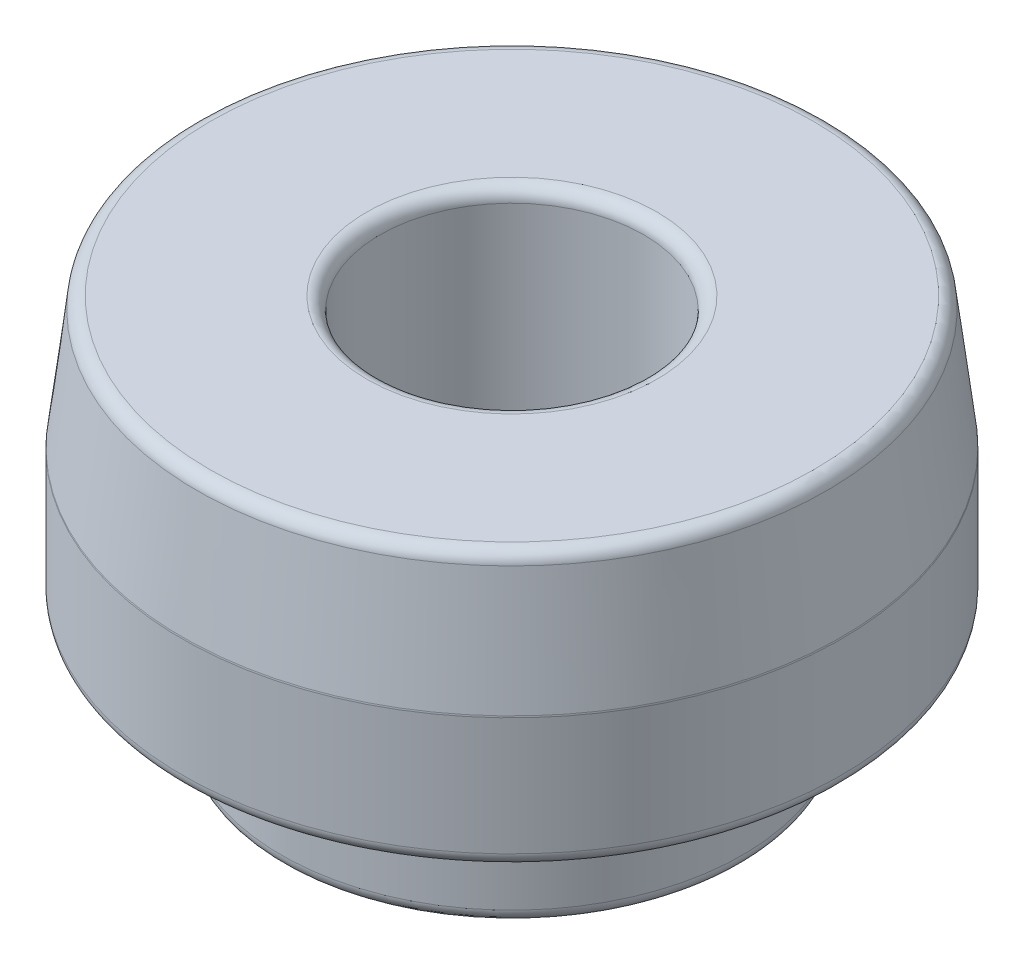
ISO-10303-21;
HEADER;
FILE_DESCRIPTION(('STEP AP214'),'2;1');
FILE_NAME('part.step','',(''),(''),'','','');
FILE_SCHEMA(('AUTOMOTIVE_DESIGN { 1 0 10303 214 1 1 1 1 }'));
ENDSEC;
DATA;
#1=APPLICATION_CONTEXT('core data for automotive mechanical design processes');
#2=APPLICATION_PROTOCOL_DEFINITION('international standard','automotive_design',2000,#1);
#3=PRODUCT_CONTEXT('',#1,'mechanical');
#4=PRODUCT('Part','Part','',(#3));
#5=PRODUCT_RELATED_PRODUCT_CATEGORY('part','',(#4));
#6=PRODUCT_DEFINITION_FORMATION('','',#4);
#7=PRODUCT_DEFINITION_CONTEXT('part definition',#1,'design');
#8=PRODUCT_DEFINITION('design','',#6,#7);
#9=PRODUCT_DEFINITION_SHAPE('','',#8);
#10=(LENGTH_UNIT() NAMED_UNIT(*) SI_UNIT(.MILLI.,.METRE.));
#11=(NAMED_UNIT(*) PLANE_ANGLE_UNIT() SI_UNIT($,.RADIAN.));
#12=(NAMED_UNIT(*) SI_UNIT($,.STERADIAN.) SOLID_ANGLE_UNIT());
#13=UNCERTAINTY_MEASURE_WITH_UNIT(LENGTH_MEASURE(1.E-05),#10,'distance_accuracy_value','');
#14=(GEOMETRIC_REPRESENTATION_CONTEXT(3) GLOBAL_UNCERTAINTY_ASSIGNED_CONTEXT((#13)) GLOBAL_UNIT_ASSIGNED_CONTEXT((#10,
#11,#12)) REPRESENTATION_CONTEXT('',''));
#15=CARTESIAN_POINT('',(0.,0.,0.));
#16=DIRECTION('',(0.,0.,1.));
#17=DIRECTION('',(1.,0.,0.));
#18=AXIS2_PLACEMENT_3D('',#15,#16,#17);
#19=CARTESIAN_POINT('',(0.,-4.,0.));
#20=DIRECTION('',(0.,-1.,0.));
#21=DIRECTION('',(0.,0.,-1.));
#22=AXIS2_PLACEMENT_3D('',#19,#20,#21);
#23=TOROIDAL_SURFACE('',#22,5.5,0.5);
#24=CARTESIAN_POINT('',(0.,-4.5,0.));
#25=DIRECTION('',(0.,-1.,0.));
#26=DIRECTION('',(0.,0.,-1.));
#27=AXIS2_PLACEMENT_3D('',#24,#25,#26);
#28=CIRCLE('',#27,5.5);
#29=CARTESIAN_POINT('',(0.,-4.5,-5.5));
#30=VERTEX_POINT('',#29);
#31=EDGE_CURVE('E76',#30,#30,#28,.T.);
#32=ORIENTED_EDGE('',*,*,#31,.T.);
#33=EDGE_LOOP('',(#32));
#34=FACE_BOUND('',#33,.T.);
#35=CARTESIAN_POINT('',(0.,-4.,0.));
#36=DIRECTION('',(0.,-1.,0.));
#37=DIRECTION('',(0.,0.,-1.));
#38=AXIS2_PLACEMENT_3D('',#35,#36,#37);
#39=CIRCLE('',#38,5.);
#40=CARTESIAN_POINT('',(0.,-4.,-5.));
#41=VERTEX_POINT('',#40);
#42=EDGE_CURVE('E10',#41,#41,#39,.T.);
#43=ORIENTED_EDGE('',*,*,#42,.F.);
#44=EDGE_LOOP('',(#43));
#45=FACE_BOUND('',#44,.T.);
#46=ADVANCED_FACE('F30',(#34,#45),#23,.T.);
#47=CARTESIAN_POINT('',(0.,0.,0.));
#48=DIRECTION('',(0.,-1.,0.));
#49=DIRECTION('',(0.,0.,-1.));
#50=AXIS2_PLACEMENT_3D('',#47,#48,#49);
#51=CYLINDRICAL_SURFACE('',#50,5.);
#52=ORIENTED_EDGE('',*,*,#42,.T.);
#53=EDGE_LOOP('',(#52));
#54=FACE_BOUND('',#53,.T.);
#55=CARTESIAN_POINT('',(0.,9.5,0.));
#56=DIRECTION('',(0.,-1.,0.));
#57=DIRECTION('',(0.,0.,-1.));
#58=AXIS2_PLACEMENT_3D('',#55,#56,#57);
#59=CIRCLE('',#58,5.);
#60=CARTESIAN_POINT('',(0.,9.5,-5.));
#61=VERTEX_POINT('',#60);
#62=EDGE_CURVE('E36',#61,#61,#59,.T.);
#63=ORIENTED_EDGE('',*,*,#62,.F.);
#64=EDGE_LOOP('',(#63));
#65=FACE_BOUND('',#64,.T.);
#66=ADVANCED_FACE('F94',(#54,#65),#51,.F.);
#67=CARTESIAN_POINT('',(0.,9.5,0.));
#68=DIRECTION('',(0.,-1.,0.));
#69=DIRECTION('',(0.,0.,-1.));
#70=AXIS2_PLACEMENT_3D('',#67,#68,#69);
#71=TOROIDAL_SURFACE('',#70,5.5,0.5);
#72=ORIENTED_EDGE('',*,*,#62,.T.);
#73=EDGE_LOOP('',(#72));
#74=FACE_BOUND('',#73,.T.);
#75=CARTESIAN_POINT('',(0.,10.,0.));
#76=DIRECTION('',(0.,-1.,0.));
#77=DIRECTION('',(0.,0.,-1.));
#78=AXIS2_PLACEMENT_3D('',#75,#76,#77);
#79=CIRCLE('',#78,5.5);
#80=CARTESIAN_POINT('',(0.,10.,-5.5));
#81=VERTEX_POINT('',#80);
#82=EDGE_CURVE('E40',#81,#81,#79,.T.);
#83=ORIENTED_EDGE('',*,*,#82,.F.);
#84=EDGE_LOOP('',(#83));
#85=FACE_BOUND('',#84,.T.);
#86=ADVANCED_FACE('F98',(#74,#85),#71,.T.);
#87=CARTESIAN_POINT('',(5.5,10.,0.));
#88=DIRECTION('',(0.,1.,0.));
#89=DIRECTION('',(0.,0.,1.));
#90=AXIS2_PLACEMENT_3D('',#87,#88,#89);
#91=PLANE('',#90);
#92=ORIENTED_EDGE('',*,*,#82,.T.);
#93=EDGE_LOOP('',(#92));
#94=FACE_BOUND('',#93,.T.);
#95=CARTESIAN_POINT('',(0.,10.,0.));
#96=DIRECTION('',(0.,-1.,0.));
#97=DIRECTION('',(0.,0.,-1.));
#98=AXIS2_PLACEMENT_3D('',#95,#96,#97);
#99=CIRCLE('',#98,11.4437145632075);
#100=CARTESIAN_POINT('',(0.,10.,-11.4437145632075));
#101=VERTEX_POINT('',#100);
#102=EDGE_CURVE('E44',#101,#101,#99,.T.);
#103=ORIENTED_EDGE('',*,*,#102,.F.);
#104=EDGE_LOOP('',(#103));
#105=FACE_BOUND('',#104,.T.);
#106=ADVANCED_FACE('F102',(#94,#105),#91,.T.);
#107=CARTESIAN_POINT('',(0.,9.5,0.));
#108=DIRECTION('',(0.,-1.,0.));
#109=DIRECTION('',(0.,0.,-1.));
#110=AXIS2_PLACEMENT_3D('',#107,#108,#109);
#111=TOROIDAL_SURFACE('',#110,11.4437145632075,0.5);
#112=ORIENTED_EDGE('',*,*,#102,.T.);
#113=EDGE_LOOP('',(#112));
#114=FACE_BOUND('',#113,.T.);
#115=CARTESIAN_POINT('',(0.,9.56093467170257,0.));
#116=DIRECTION('',(0.,-1.,0.));
#117=DIRECTION('',(0.,0.,-1.));
#118=AXIS2_PLACEMENT_3D('',#115,#116,#117);
#119=CIRCLE('',#118,11.9399876390282);
#120=CARTESIAN_POINT('',(0.,9.56093467170257,-11.9399876390282));
#121=VERTEX_POINT('',#120);
#122=EDGE_CURVE('E49',#121,#121,#119,.T.);
#123=ORIENTED_EDGE('',*,*,#122,.F.);
#124=EDGE_LOOP('',(#123));
#125=FACE_BOUND('',#124,.T.);
#126=ADVANCED_FACE('F108',(#114,#125),#111,.T.);
#127=CARTESIAN_POINT('',(0.,5.03035336162733,0.));
#128=DIRECTION('',(0.,-1.,0.));
#129=DIRECTION('',(0.,0.,-1.));
#130=AXIS2_PLACEMENT_3D('',#127,#128,#129);
#131=CONICAL_SURFACE('',#130,12.4962730758207,0.1221730476396);
#132=ORIENTED_EDGE('',*,*,#122,.T.);
#133=EDGE_LOOP('',(#132));
#134=FACE_BOUND('',#133,.T.);
#135=CARTESIAN_POINT('',(0.,5.03035336162733,0.));
#136=DIRECTION('',(0.,-1.,0.));
#137=DIRECTION('',(0.,0.,-1.));
#138=AXIS2_PLACEMENT_3D('',#135,#136,#137);
#139=CIRCLE('',#138,12.4962730758207);
#140=CARTESIAN_POINT('',(0.,5.03035336162733,-12.4962730758207));
#141=VERTEX_POINT('',#140);
#142=EDGE_CURVE('E52',#141,#141,#139,.T.);
#143=ORIENTED_EDGE('',*,*,#142,.F.);
#144=EDGE_LOOP('',(#143));
#145=FACE_BOUND('',#144,.T.);
#146=ADVANCED_FACE('F112',(#134,#145),#131,.T.);
#147=CARTESIAN_POINT('',(0.,4.96941868992476,0.));
#148=DIRECTION('',(0.,-1.,0.));
#149=DIRECTION('',(0.,0.,-1.));
#150=AXIS2_PLACEMENT_3D('',#147,#148,#149);
#151=TOROIDAL_SURFACE('',#150,12.,0.5);
#152=ORIENTED_EDGE('',*,*,#142,.T.);
#153=EDGE_LOOP('',(#152));
#154=FACE_BOUND('',#153,.T.);
#155=CARTESIAN_POINT('',(0.,4.96941868992476,0.));
#156=DIRECTION('',(0.,-1.,0.));
#157=DIRECTION('',(0.,0.,-1.));
#158=AXIS2_PLACEMENT_3D('',#155,#156,#157);
#159=CIRCLE('',#158,12.5);
#160=CARTESIAN_POINT('',(0.,4.96941868992476,-12.5));
#161=VERTEX_POINT('',#160);
#162=EDGE_CURVE('E55',#161,#161,#159,.T.);
#163=ORIENTED_EDGE('',*,*,#162,.F.);
#164=EDGE_LOOP('',(#163));
#165=FACE_BOUND('',#164,.T.);
#166=ADVANCED_FACE('F116',(#154,#165),#151,.T.);
#167=CARTESIAN_POINT('',(0.,0.,0.));
#168=DIRECTION('',(0.,-1.,0.));
#169=DIRECTION('',(0.,0.,-1.));
#170=AXIS2_PLACEMENT_3D('',#167,#168,#169);
#171=CYLINDRICAL_SURFACE('',#170,12.5);
#172=ORIENTED_EDGE('',*,*,#162,.T.);
#173=EDGE_LOOP('',(#172));
#174=FACE_BOUND('',#173,.T.);
#175=CARTESIAN_POINT('',(0.,0.500000000000004,0.));
#176=DIRECTION('',(0.,-1.,0.));
#177=DIRECTION('',(0.,0.,-1.));
#178=AXIS2_PLACEMENT_3D('',#175,#176,#177);
#179=CIRCLE('',#178,12.5);
#180=CARTESIAN_POINT('',(0.,0.500000000000004,-12.5));
#181=VERTEX_POINT('',#180);
#182=EDGE_CURVE('E58',#181,#181,#179,.T.);
#183=ORIENTED_EDGE('',*,*,#182,.F.);
#184=EDGE_LOOP('',(#183));
#185=FACE_BOUND('',#184,.T.);
#186=ADVANCED_FACE('F120',(#174,#185),#171,.T.);
#187=CARTESIAN_POINT('',(0.,0.5,0.));
#188=DIRECTION('',(0.,-1.,0.));
#189=DIRECTION('',(0.,0.,-1.));
#190=AXIS2_PLACEMENT_3D('',#187,#188,#189);
#191=TOROIDAL_SURFACE('',#190,12.,0.5);
#192=ORIENTED_EDGE('',*,*,#182,.T.);
#193=EDGE_LOOP('',(#192));
#194=FACE_BOUND('',#193,.T.);
#195=CARTESIAN_POINT('',(0.,0.,0.));
#196=DIRECTION('',(0.,-1.,0.));
#197=DIRECTION('',(0.,0.,-1.));
#198=AXIS2_PLACEMENT_3D('',#195,#196,#197);
#199=CIRCLE('',#198,12.);
#200=CARTESIAN_POINT('',(0.,0.,-12.));
#201=VERTEX_POINT('',#200);
#202=EDGE_CURVE('E61',#201,#201,#199,.T.);
#203=ORIENTED_EDGE('',*,*,#202,.F.);
#204=EDGE_LOOP('',(#203));
#205=FACE_BOUND('',#204,.T.);
#206=ADVANCED_FACE('F124',(#194,#205),#191,.T.);
#207=CARTESIAN_POINT('',(12.,0.,0.));
#208=DIRECTION('',(0.,-1.,0.));
#209=DIRECTION('',(0.,0.,-1.));
#210=AXIS2_PLACEMENT_3D('',#207,#208,#209);
#211=PLANE('',#210);
#212=ORIENTED_EDGE('',*,*,#202,.T.);
#213=EDGE_LOOP('',(#212));
#214=FACE_BOUND('',#213,.T.);
#215=CARTESIAN_POINT('',(0.,0.,0.));
#216=DIRECTION('',(0.,-1.,0.));
#217=DIRECTION('',(0.,0.,-1.));
#218=AXIS2_PLACEMENT_3D('',#215,#216,#217);
#219=CIRCLE('',#218,9.25);
#220=CARTESIAN_POINT('',(0.,0.,-9.25));
#221=VERTEX_POINT('',#220);
#222=EDGE_CURVE('E64',#221,#221,#219,.T.);
#223=ORIENTED_EDGE('',*,*,#222,.F.);
#224=EDGE_LOOP('',(#223));
#225=FACE_BOUND('',#224,.T.);
#226=ADVANCED_FACE('F128',(#214,#225),#211,.T.);
#227=CARTESIAN_POINT('',(0.,-0.5,0.));
#228=DIRECTION('',(0.,-1.,0.));
#229=DIRECTION('',(0.,0.,-1.));
#230=AXIS2_PLACEMENT_3D('',#227,#228,#229);
#231=TOROIDAL_SURFACE('',#230,9.25,0.5);
#232=ORIENTED_EDGE('',*,*,#222,.T.);
#233=EDGE_LOOP('',(#232));
#234=FACE_BOUND('',#233,.T.);
#235=CARTESIAN_POINT('',(0.,-0.500000000000004,0.));
#236=DIRECTION('',(0.,-1.,0.));
#237=DIRECTION('',(0.,0.,-1.));
#238=AXIS2_PLACEMENT_3D('',#235,#236,#237);
#239=CIRCLE('',#238,8.75);
#240=CARTESIAN_POINT('',(0.,-0.500000000000004,-8.75));
#241=VERTEX_POINT('',#240);
#242=EDGE_CURVE('E67',#241,#241,#239,.T.);
#243=ORIENTED_EDGE('',*,*,#242,.F.);
#244=EDGE_LOOP('',(#243));
#245=FACE_BOUND('',#244,.T.);
#246=ADVANCED_FACE('F132',(#234,#245),#231,.F.);
#247=CARTESIAN_POINT('',(0.,0.,0.));
#248=DIRECTION('',(0.,-1.,0.));
#249=DIRECTION('',(0.,0.,-1.));
#250=AXIS2_PLACEMENT_3D('',#247,#248,#249);
#251=CYLINDRICAL_SURFACE('',#250,8.75);
#252=ORIENTED_EDGE('',*,*,#242,.T.);
#253=EDGE_LOOP('',(#252));
#254=FACE_BOUND('',#253,.T.);
#255=CARTESIAN_POINT('',(0.,-4.,0.));
#256=DIRECTION('',(0.,-1.,0.));
#257=DIRECTION('',(0.,0.,-1.));
#258=AXIS2_PLACEMENT_3D('',#255,#256,#257);
#259=CIRCLE('',#258,8.75);
#260=CARTESIAN_POINT('',(0.,-4.,-8.75));
#261=VERTEX_POINT('',#260);
#262=EDGE_CURVE('E70',#261,#261,#259,.T.);
#263=ORIENTED_EDGE('',*,*,#262,.F.);
#264=EDGE_LOOP('',(#263));
#265=FACE_BOUND('',#264,.T.);
#266=ADVANCED_FACE('F90',(#254,#265),#251,.T.);
#267=CARTESIAN_POINT('',(0.,-4.,0.));
#268=DIRECTION('',(0.,-1.,0.));
#269=DIRECTION('',(0.,0.,-1.));
#270=AXIS2_PLACEMENT_3D('',#267,#268,#269);
#271=TOROIDAL_SURFACE('',#270,8.25,0.5);
#272=ORIENTED_EDGE('',*,*,#262,.T.);
#273=EDGE_LOOP('',(#272));
#274=FACE_BOUND('',#273,.T.);
#275=CARTESIAN_POINT('',(0.,-4.5,0.));
#276=DIRECTION('',(0.,-1.,0.));
#277=DIRECTION('',(0.,0.,-1.));
#278=AXIS2_PLACEMENT_3D('',#275,#276,#277);
#279=CIRCLE('',#278,8.24999999999999);
#280=CARTESIAN_POINT('',(0.,-4.5,-8.24999999999999));
#281=VERTEX_POINT('',#280);
#282=EDGE_CURVE('E73',#281,#281,#279,.T.);
#283=ORIENTED_EDGE('',*,*,#282,.F.);
#284=EDGE_LOOP('',(#283));
#285=FACE_BOUND('',#284,.T.);
#286=ADVANCED_FACE('F84',(#274,#285),#271,.T.);
#287=CARTESIAN_POINT('',(8.24999999999999,-4.5,0.));
#288=DIRECTION('',(0.,-1.,0.));
#289=DIRECTION('',(0.,0.,-1.));
#290=AXIS2_PLACEMENT_3D('',#287,#288,#289);
#291=PLANE('',#290);
#292=ORIENTED_EDGE('',*,*,#282,.T.);
#293=EDGE_LOOP('',(#292));
#294=FACE_BOUND('',#293,.T.);
#295=ORIENTED_EDGE('',*,*,#31,.F.);
#296=EDGE_LOOP('',(#295));
#297=FACE_BOUND('',#296,.T.);
#298=ADVANCED_FACE('F82',(#294,#297),#291,.T.);
#299=CLOSED_SHELL('',(#46,#66,#86,#106,#126,#146,#166,#186,#206,#226,#246,#266,#286,#298));
#300=MANIFOLD_SOLID_BREP('B2',#299);
#301=ADVANCED_BREP_SHAPE_REPRESENTATION('',(#18,#300),#14);
#302=SHAPE_DEFINITION_REPRESENTATION(#9,#301);
ENDSEC;
END-ISO-10303-21;
